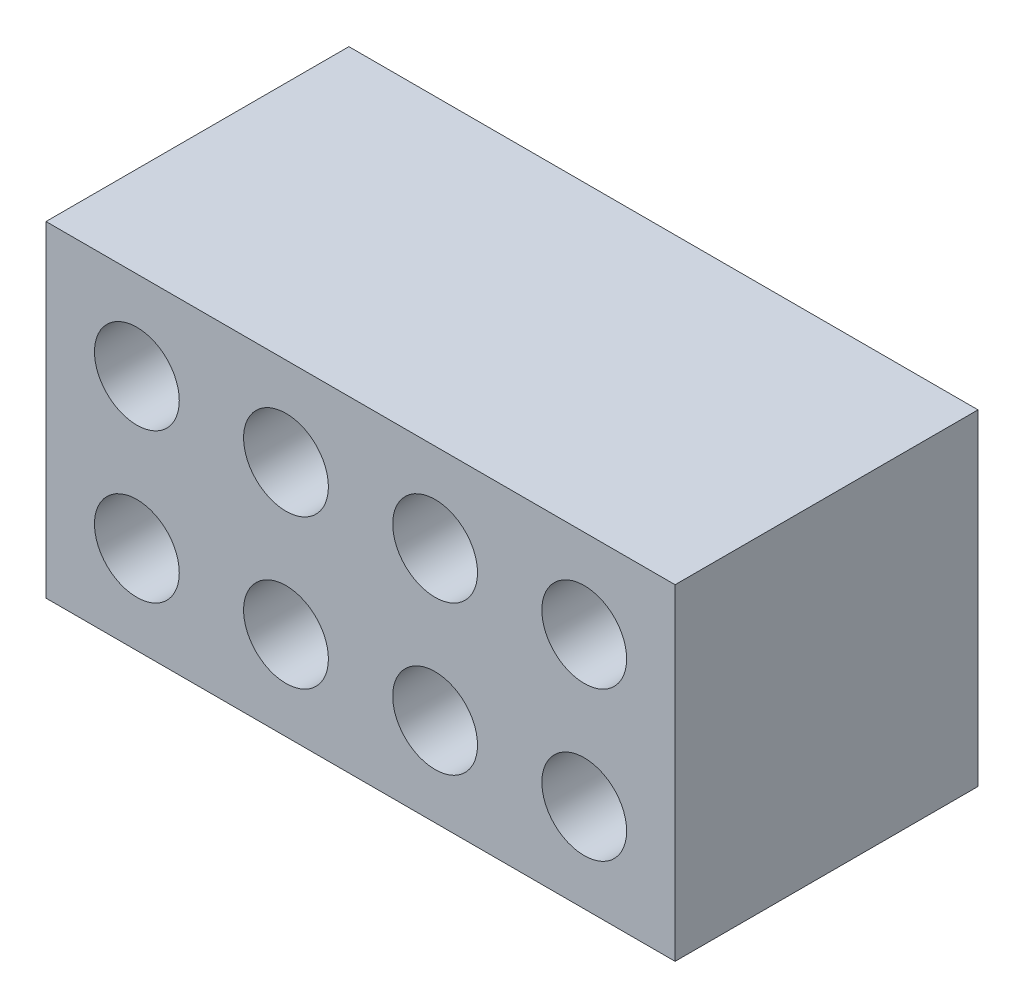
ISO-10303-21;
HEADER;
FILE_DESCRIPTION(('STEP AP214'),'2;1');
FILE_NAME('part.step','',(''),(''),'','','');
FILE_SCHEMA(('AUTOMOTIVE_DESIGN { 1 0 10303 214 1 1 1 1 }'));
ENDSEC;
DATA;
#1=APPLICATION_CONTEXT('core data for automotive mechanical design processes');
#2=APPLICATION_PROTOCOL_DEFINITION('international standard','automotive_design',2000,#1);
#3=PRODUCT_CONTEXT('',#1,'mechanical');
#4=PRODUCT('Part','Part','',(#3));
#5=PRODUCT_RELATED_PRODUCT_CATEGORY('part','',(#4));
#6=PRODUCT_DEFINITION_FORMATION('','',#4);
#7=PRODUCT_DEFINITION_CONTEXT('part definition',#1,'design');
#8=PRODUCT_DEFINITION('design','',#6,#7);
#9=PRODUCT_DEFINITION_SHAPE('','',#8);
#10=(LENGTH_UNIT() NAMED_UNIT(*) SI_UNIT(.MILLI.,.METRE.));
#11=(NAMED_UNIT(*) PLANE_ANGLE_UNIT() SI_UNIT($,.RADIAN.));
#12=(NAMED_UNIT(*) SI_UNIT($,.STERADIAN.) SOLID_ANGLE_UNIT());
#13=UNCERTAINTY_MEASURE_WITH_UNIT(LENGTH_MEASURE(1.E-05),#10,'distance_accuracy_value','');
#14=(GEOMETRIC_REPRESENTATION_CONTEXT(3) GLOBAL_UNCERTAINTY_ASSIGNED_CONTEXT((#13)) GLOBAL_UNIT_ASSIGNED_CONTEXT((#10,
#11,#12)) REPRESENTATION_CONTEXT('',''));
#15=CARTESIAN_POINT('',(0.,0.,0.));
#16=DIRECTION('',(0.,0.,1.));
#17=DIRECTION('',(1.,0.,0.));
#18=AXIS2_PLACEMENT_3D('',#15,#16,#17);
#19=CARTESIAN_POINT('',(67.5,-35.,65.));
#20=DIRECTION('',(-1.,0.,0.));
#21=DIRECTION('',(0.,0.,1.));
#22=AXIS2_PLACEMENT_3D('',#19,#20,#21);
#23=PLANE('',#22);
#24=DIRECTION('',(0.,1.,0.));
#25=VECTOR('',#24,1.);
#26=CARTESIAN_POINT('',(67.5,-35.,0.));
#27=LINE('',#26,#25);
#28=CARTESIAN_POINT('',(67.5,-35.,0.));
#29=VERTEX_POINT('',#28);
#30=CARTESIAN_POINT('',(67.5,35.,0.));
#31=VERTEX_POINT('',#30);
#32=EDGE_CURVE('E104',#29,#31,#27,.T.);
#33=ORIENTED_EDGE('',*,*,#32,.T.);
#34=DIRECTION('',(0.,0.,-1.));
#35=VECTOR('',#34,1.);
#36=CARTESIAN_POINT('',(67.5,35.,65.));
#37=LINE('',#36,#35);
#38=CARTESIAN_POINT('',(67.5,35.,65.));
#39=VERTEX_POINT('',#38);
#40=EDGE_CURVE('E11',#39,#31,#37,.T.);
#41=ORIENTED_EDGE('',*,*,#40,.F.);
#42=DIRECTION('',(0.,1.,0.));
#43=VECTOR('',#42,1.);
#44=CARTESIAN_POINT('',(67.5,-35.,65.));
#45=LINE('',#44,#43);
#46=CARTESIAN_POINT('',(67.5,-35.,65.));
#47=VERTEX_POINT('',#46);
#48=EDGE_CURVE('E95',#47,#39,#45,.T.);
#49=ORIENTED_EDGE('',*,*,#48,.F.);
#50=DIRECTION('',(0.,0.,-1.));
#51=VECTOR('',#50,1.);
#52=CARTESIAN_POINT('',(67.5,-35.,65.));
#53=LINE('',#52,#51);
#54=EDGE_CURVE('E101',#47,#29,#53,.T.);
#55=ORIENTED_EDGE('',*,*,#54,.T.);
#56=EDGE_LOOP('',(#33,#41,#49,#55));
#57=FACE_BOUND('',#56,.T.);
#58=ADVANCED_FACE('F39',(#57),#23,.F.);
#59=CARTESIAN_POINT('',(-67.5,35.,65.));
#60=DIRECTION('',(0.,-1.,0.));
#61=DIRECTION('',(0.,0.,-1.));
#62=AXIS2_PLACEMENT_3D('',#59,#60,#61);
#63=PLANE('',#62);
#64=DIRECTION('',(-1.,0.,0.));
#65=VECTOR('',#64,1.);
#66=CARTESIAN_POINT('',(-67.5,35.,0.));
#67=LINE('',#66,#65);
#68=CARTESIAN_POINT('',(-67.5,35.,0.));
#69=VERTEX_POINT('',#68);
#70=EDGE_CURVE('E96',#31,#69,#67,.T.);
#71=ORIENTED_EDGE('',*,*,#70,.T.);
#72=DIRECTION('',(0.,0.,-1.));
#73=VECTOR('',#72,1.);
#74=CARTESIAN_POINT('',(-67.5,35.,65.));
#75=LINE('',#74,#73);
#76=CARTESIAN_POINT('',(-67.5,35.,65.));
#77=VERTEX_POINT('',#76);
#78=EDGE_CURVE('E48',#77,#69,#75,.T.);
#79=ORIENTED_EDGE('',*,*,#78,.F.);
#80=DIRECTION('',(-1.,0.,0.));
#81=VECTOR('',#80,1.);
#82=CARTESIAN_POINT('',(-67.5,35.,65.));
#83=LINE('',#82,#81);
#84=EDGE_CURVE('E87',#39,#77,#83,.T.);
#85=ORIENTED_EDGE('',*,*,#84,.F.);
#86=ORIENTED_EDGE('',*,*,#40,.T.);
#87=EDGE_LOOP('',(#71,#79,#85,#86));
#88=FACE_BOUND('',#87,.T.);
#89=ADVANCED_FACE('F92',(#88),#63,.F.);
#90=CARTESIAN_POINT('',(-67.5,-35.,65.));
#91=DIRECTION('',(1.,0.,0.));
#92=DIRECTION('',(0.,0.,-1.));
#93=AXIS2_PLACEMENT_3D('',#90,#91,#92);
#94=PLANE('',#93);
#95=DIRECTION('',(0.,-1.,0.));
#96=VECTOR('',#95,1.);
#97=CARTESIAN_POINT('',(-67.5,-35.,0.));
#98=LINE('',#97,#96);
#99=CARTESIAN_POINT('',(-67.5,-35.,0.));
#100=VERTEX_POINT('',#99);
#101=EDGE_CURVE('E74',#69,#100,#98,.T.);
#102=ORIENTED_EDGE('',*,*,#101,.T.);
#103=DIRECTION('',(0.,0.,-1.));
#104=VECTOR('',#103,1.);
#105=CARTESIAN_POINT('',(-67.5,-35.,65.));
#106=LINE('',#105,#104);
#107=CARTESIAN_POINT('',(-67.5,-35.,65.));
#108=VERTEX_POINT('',#107);
#109=EDGE_CURVE('E100',#108,#100,#106,.T.);
#110=ORIENTED_EDGE('',*,*,#109,.F.);
#111=DIRECTION('',(0.,-1.,0.));
#112=VECTOR('',#111,1.);
#113=CARTESIAN_POINT('',(-67.5,-35.,65.));
#114=LINE('',#113,#112);
#115=EDGE_CURVE('E89',#77,#108,#114,.T.);
#116=ORIENTED_EDGE('',*,*,#115,.F.);
#117=ORIENTED_EDGE('',*,*,#78,.T.);
#118=EDGE_LOOP('',(#102,#110,#116,#117));
#119=FACE_BOUND('',#118,.T.);
#120=ADVANCED_FACE('F97',(#119),#94,.F.);
#121=CARTESIAN_POINT('',(-67.5,-35.,65.));
#122=DIRECTION('',(0.,1.,0.));
#123=DIRECTION('',(0.,0.,1.));
#124=AXIS2_PLACEMENT_3D('',#121,#122,#123);
#125=PLANE('',#124);
#126=DIRECTION('',(1.,0.,0.));
#127=VECTOR('',#126,1.);
#128=CARTESIAN_POINT('',(-67.5,-35.,0.));
#129=LINE('',#128,#127);
#130=EDGE_CURVE('E76',#100,#29,#129,.T.);
#131=ORIENTED_EDGE('',*,*,#130,.T.);
#132=ORIENTED_EDGE('',*,*,#54,.F.);
#133=DIRECTION('',(1.,0.,0.));
#134=VECTOR('',#133,1.);
#135=CARTESIAN_POINT('',(-67.5,-35.,65.));
#136=LINE('',#135,#134);
#137=EDGE_CURVE('E60',#108,#47,#136,.T.);
#138=ORIENTED_EDGE('',*,*,#137,.F.);
#139=ORIENTED_EDGE('',*,*,#109,.T.);
#140=EDGE_LOOP('',(#131,#132,#138,#139));
#141=FACE_BOUND('',#140,.T.);
#142=ADVANCED_FACE('F161',(#141),#125,.F.);
#143=CARTESIAN_POINT('',(0.,0.,65.));
#144=DIRECTION('',(0.,0.,-1.));
#145=DIRECTION('',(-1.,0.,0.));
#146=AXIS2_PLACEMENT_3D('',#143,#144,#145);
#147=PLANE('',#146);
#148=CARTESIAN_POINT('',(-48.,16.,65.));
#149=DIRECTION('',(0.,0.,1.));
#150=DIRECTION('',(1.,0.,0.));
#151=AXIS2_PLACEMENT_3D('',#148,#149,#150);
#152=CIRCLE('',#151,9.1);
#153=CARTESIAN_POINT('',(-38.9,16.,65.));
#154=VERTEX_POINT('',#153);
#155=EDGE_CURVE('E285',#154,#154,#152,.T.);
#156=ORIENTED_EDGE('',*,*,#155,.F.);
#157=EDGE_LOOP('',(#156));
#158=FACE_BOUND('',#157,.T.);
#159=CARTESIAN_POINT('',(48.,-16.,65.));
#160=DIRECTION('',(0.,0.,1.));
#161=DIRECTION('',(1.,0.,0.));
#162=AXIS2_PLACEMENT_3D('',#159,#160,#161);
#163=CIRCLE('',#162,9.1);
#164=CARTESIAN_POINT('',(57.1,-16.,65.));
#165=VERTEX_POINT('',#164);
#166=EDGE_CURVE('E283',#165,#165,#163,.T.);
#167=ORIENTED_EDGE('',*,*,#166,.F.);
#168=EDGE_LOOP('',(#167));
#169=FACE_BOUND('',#168,.T.);
#170=CARTESIAN_POINT('',(16.,-16.,65.));
#171=DIRECTION('',(0.,0.,1.));
#172=DIRECTION('',(1.,0.,0.));
#173=AXIS2_PLACEMENT_3D('',#170,#171,#172);
#174=CIRCLE('',#173,9.1);
#175=CARTESIAN_POINT('',(25.1,-16.,65.));
#176=VERTEX_POINT('',#175);
#177=EDGE_CURVE('E282',#176,#176,#174,.T.);
#178=ORIENTED_EDGE('',*,*,#177,.F.);
#179=EDGE_LOOP('',(#178));
#180=FACE_BOUND('',#179,.T.);
#181=CARTESIAN_POINT('',(-16.,-16.,65.));
#182=DIRECTION('',(0.,0.,1.));
#183=DIRECTION('',(1.,0.,0.));
#184=AXIS2_PLACEMENT_3D('',#181,#182,#183);
#185=CIRCLE('',#184,9.1);
#186=CARTESIAN_POINT('',(-6.9,-16.,65.));
#187=VERTEX_POINT('',#186);
#188=EDGE_CURVE('E290',#187,#187,#185,.T.);
#189=ORIENTED_EDGE('',*,*,#188,.F.);
#190=EDGE_LOOP('',(#189));
#191=FACE_BOUND('',#190,.T.);
#192=CARTESIAN_POINT('',(-16.,16.,65.));
#193=DIRECTION('',(0.,0.,1.));
#194=DIRECTION('',(1.,0.,0.));
#195=AXIS2_PLACEMENT_3D('',#192,#193,#194);
#196=CIRCLE('',#195,9.1);
#197=CARTESIAN_POINT('',(-6.9,16.,65.));
#198=VERTEX_POINT('',#197);
#199=EDGE_CURVE('E288',#198,#198,#196,.T.);
#200=ORIENTED_EDGE('',*,*,#199,.F.);
#201=EDGE_LOOP('',(#200));
#202=FACE_BOUND('',#201,.T.);
#203=CARTESIAN_POINT('',(16.,16.,65.));
#204=DIRECTION('',(0.,0.,1.));
#205=DIRECTION('',(1.,0.,0.));
#206=AXIS2_PLACEMENT_3D('',#203,#204,#205);
#207=CIRCLE('',#206,9.1);
#208=CARTESIAN_POINT('',(25.1,16.,65.));
#209=VERTEX_POINT('',#208);
#210=EDGE_CURVE('E315',#209,#209,#207,.T.);
#211=ORIENTED_EDGE('',*,*,#210,.F.);
#212=EDGE_LOOP('',(#211));
#213=FACE_BOUND('',#212,.T.);
#214=CARTESIAN_POINT('',(48.,16.,65.));
#215=DIRECTION('',(0.,0.,1.));
#216=DIRECTION('',(1.,0.,0.));
#217=AXIS2_PLACEMENT_3D('',#214,#215,#216);
#218=CIRCLE('',#217,9.1);
#219=CARTESIAN_POINT('',(57.1,16.,65.));
#220=VERTEX_POINT('',#219);
#221=EDGE_CURVE('E291',#220,#220,#218,.T.);
#222=ORIENTED_EDGE('',*,*,#221,.F.);
#223=EDGE_LOOP('',(#222));
#224=FACE_BOUND('',#223,.T.);
#225=CARTESIAN_POINT('',(-48.,-16.,65.));
#226=DIRECTION('',(0.,0.,1.));
#227=DIRECTION('',(1.,0.,0.));
#228=AXIS2_PLACEMENT_3D('',#225,#226,#227);
#229=CIRCLE('',#228,9.1);
#230=CARTESIAN_POINT('',(-38.9,-16.,65.));
#231=VERTEX_POINT('',#230);
#232=EDGE_CURVE('E119',#231,#231,#229,.T.);
#233=ORIENTED_EDGE('',*,*,#232,.F.);
#234=EDGE_LOOP('',(#233));
#235=FACE_BOUND('',#234,.T.);
#236=ORIENTED_EDGE('',*,*,#48,.T.);
#237=ORIENTED_EDGE('',*,*,#84,.T.);
#238=ORIENTED_EDGE('',*,*,#115,.T.);
#239=ORIENTED_EDGE('',*,*,#137,.T.);
#240=EDGE_LOOP('',(#236,#237,#238,#239));
#241=FACE_BOUND('',#240,.T.);
#242=ADVANCED_FACE('F86',(#158,#169,#180,#191,#202,#213,#224,#235,#241),#147,.F.);
#243=CARTESIAN_POINT('',(0.,0.,0.));
#244=DIRECTION('',(0.,0.,-1.));
#245=DIRECTION('',(-1.,0.,0.));
#246=AXIS2_PLACEMENT_3D('',#243,#244,#245);
#247=PLANE('',#246);
#248=CARTESIAN_POINT('',(-48.,16.,0.));
#249=DIRECTION('',(0.,0.,-1.));
#250=DIRECTION('',(-1.,0.,0.));
#251=AXIS2_PLACEMENT_3D('',#248,#249,#250);
#252=CIRCLE('',#251,9.1);
#253=CARTESIAN_POINT('',(-57.1,16.,0.));
#254=VERTEX_POINT('',#253);
#255=EDGE_CURVE('E45',#254,#254,#252,.T.);
#256=ORIENTED_EDGE('',*,*,#255,.F.);
#257=EDGE_LOOP('',(#256));
#258=FACE_BOUND('',#257,.T.);
#259=CARTESIAN_POINT('',(48.,-16.,0.));
#260=DIRECTION('',(0.,0.,-1.));
#261=DIRECTION('',(-1.,0.,0.));
#262=AXIS2_PLACEMENT_3D('',#259,#260,#261);
#263=CIRCLE('',#262,9.1);
#264=CARTESIAN_POINT('',(38.9,-16.,0.));
#265=VERTEX_POINT('',#264);
#266=EDGE_CURVE('E133',#265,#265,#263,.T.);
#267=ORIENTED_EDGE('',*,*,#266,.F.);
#268=EDGE_LOOP('',(#267));
#269=FACE_BOUND('',#268,.T.);
#270=CARTESIAN_POINT('',(16.,-16.,0.));
#271=DIRECTION('',(0.,0.,-1.));
#272=DIRECTION('',(-1.,0.,0.));
#273=AXIS2_PLACEMENT_3D('',#270,#271,#272);
#274=CIRCLE('',#273,9.1);
#275=CARTESIAN_POINT('',(6.9,-16.,0.));
#276=VERTEX_POINT('',#275);
#277=EDGE_CURVE('E129',#276,#276,#274,.T.);
#278=ORIENTED_EDGE('',*,*,#277,.F.);
#279=EDGE_LOOP('',(#278));
#280=FACE_BOUND('',#279,.T.);
#281=CARTESIAN_POINT('',(-16.,-16.,0.));
#282=DIRECTION('',(0.,0.,-1.));
#283=DIRECTION('',(-1.,0.,0.));
#284=AXIS2_PLACEMENT_3D('',#281,#282,#283);
#285=CIRCLE('',#284,9.1);
#286=CARTESIAN_POINT('',(-25.1,-16.,0.));
#287=VERTEX_POINT('',#286);
#288=EDGE_CURVE('E127',#287,#287,#285,.T.);
#289=ORIENTED_EDGE('',*,*,#288,.F.);
#290=EDGE_LOOP('',(#289));
#291=FACE_BOUND('',#290,.T.);
#292=CARTESIAN_POINT('',(-16.,16.,0.));
#293=DIRECTION('',(0.,0.,-1.));
#294=DIRECTION('',(-1.,0.,0.));
#295=AXIS2_PLACEMENT_3D('',#292,#293,#294);
#296=CIRCLE('',#295,9.1);
#297=CARTESIAN_POINT('',(-25.1,16.,0.));
#298=VERTEX_POINT('',#297);
#299=EDGE_CURVE('E124',#298,#298,#296,.T.);
#300=ORIENTED_EDGE('',*,*,#299,.F.);
#301=EDGE_LOOP('',(#300));
#302=FACE_BOUND('',#301,.T.);
#303=CARTESIAN_POINT('',(16.,16.,0.));
#304=DIRECTION('',(0.,0.,-1.));
#305=DIRECTION('',(-1.,0.,0.));
#306=AXIS2_PLACEMENT_3D('',#303,#304,#305);
#307=CIRCLE('',#306,9.1);
#308=CARTESIAN_POINT('',(6.9,16.,0.));
#309=VERTEX_POINT('',#308);
#310=EDGE_CURVE('E116',#309,#309,#307,.T.);
#311=ORIENTED_EDGE('',*,*,#310,.F.);
#312=EDGE_LOOP('',(#311));
#313=FACE_BOUND('',#312,.T.);
#314=CARTESIAN_POINT('',(48.,16.,0.));
#315=DIRECTION('',(0.,0.,-1.));
#316=DIRECTION('',(-1.,0.,0.));
#317=AXIS2_PLACEMENT_3D('',#314,#315,#316);
#318=CIRCLE('',#317,9.1);
#319=CARTESIAN_POINT('',(38.9,16.,0.));
#320=VERTEX_POINT('',#319);
#321=EDGE_CURVE('E118',#320,#320,#318,.T.);
#322=ORIENTED_EDGE('',*,*,#321,.F.);
#323=EDGE_LOOP('',(#322));
#324=FACE_BOUND('',#323,.T.);
#325=CARTESIAN_POINT('',(-48.,-16.,0.));
#326=DIRECTION('',(0.,0.,-1.));
#327=DIRECTION('',(-1.,0.,0.));
#328=AXIS2_PLACEMENT_3D('',#325,#326,#327);
#329=CIRCLE('',#328,9.1);
#330=CARTESIAN_POINT('',(-57.1,-16.,0.));
#331=VERTEX_POINT('',#330);
#332=EDGE_CURVE('E114',#331,#331,#329,.T.);
#333=ORIENTED_EDGE('',*,*,#332,.F.);
#334=EDGE_LOOP('',(#333));
#335=FACE_BOUND('',#334,.T.);
#336=ORIENTED_EDGE('',*,*,#32,.F.);
#337=ORIENTED_EDGE('',*,*,#130,.F.);
#338=ORIENTED_EDGE('',*,*,#101,.F.);
#339=ORIENTED_EDGE('',*,*,#70,.F.);
#340=EDGE_LOOP('',(#336,#337,#338,#339));
#341=FACE_BOUND('',#340,.T.);
#342=ADVANCED_FACE('F143',(#258,#269,#280,#291,#302,#313,#324,#335,#341),#247,.T.);
#343=CARTESIAN_POINT('',(-48.,-16.,-1.));
#344=DIRECTION('',(0.,0.,1.));
#345=DIRECTION('',(1.,0.,0.));
#346=AXIS2_PLACEMENT_3D('',#343,#344,#345);
#347=CYLINDRICAL_SURFACE('',#346,9.1);
#348=ORIENTED_EDGE('',*,*,#332,.T.);
#349=EDGE_LOOP('',(#348));
#350=FACE_BOUND('',#349,.T.);
#351=ORIENTED_EDGE('',*,*,#232,.T.);
#352=EDGE_LOOP('',(#351));
#353=FACE_BOUND('',#352,.T.);
#354=ADVANCED_FACE('F145',(#350,#353),#347,.F.);
#355=CARTESIAN_POINT('',(48.,16.,-1.));
#356=DIRECTION('',(0.,0.,1.));
#357=DIRECTION('',(1.,0.,0.));
#358=AXIS2_PLACEMENT_3D('',#355,#356,#357);
#359=CYLINDRICAL_SURFACE('',#358,9.1);
#360=ORIENTED_EDGE('',*,*,#321,.T.);
#361=EDGE_LOOP('',(#360));
#362=FACE_BOUND('',#361,.T.);
#363=ORIENTED_EDGE('',*,*,#221,.T.);
#364=EDGE_LOOP('',(#363));
#365=FACE_BOUND('',#364,.T.);
#366=ADVANCED_FACE('F208',(#362,#365),#359,.F.);
#367=CARTESIAN_POINT('',(16.,16.,-1.));
#368=DIRECTION('',(0.,0.,1.));
#369=DIRECTION('',(1.,0.,0.));
#370=AXIS2_PLACEMENT_3D('',#367,#368,#369);
#371=CYLINDRICAL_SURFACE('',#370,9.1);
#372=ORIENTED_EDGE('',*,*,#310,.T.);
#373=EDGE_LOOP('',(#372));
#374=FACE_BOUND('',#373,.T.);
#375=ORIENTED_EDGE('',*,*,#210,.T.);
#376=EDGE_LOOP('',(#375));
#377=FACE_BOUND('',#376,.T.);
#378=ADVANCED_FACE('F217',(#374,#377),#371,.F.);
#379=CARTESIAN_POINT('',(-16.,16.,-1.));
#380=DIRECTION('',(0.,0.,1.));
#381=DIRECTION('',(1.,0.,0.));
#382=AXIS2_PLACEMENT_3D('',#379,#380,#381);
#383=CYLINDRICAL_SURFACE('',#382,9.1);
#384=ORIENTED_EDGE('',*,*,#299,.T.);
#385=EDGE_LOOP('',(#384));
#386=FACE_BOUND('',#385,.T.);
#387=ORIENTED_EDGE('',*,*,#199,.T.);
#388=EDGE_LOOP('',(#387));
#389=FACE_BOUND('',#388,.T.);
#390=ADVANCED_FACE('F227',(#386,#389),#383,.F.);
#391=CARTESIAN_POINT('',(-16.,-16.,-1.));
#392=DIRECTION('',(0.,0.,1.));
#393=DIRECTION('',(1.,0.,0.));
#394=AXIS2_PLACEMENT_3D('',#391,#392,#393);
#395=CYLINDRICAL_SURFACE('',#394,9.1);
#396=ORIENTED_EDGE('',*,*,#288,.T.);
#397=EDGE_LOOP('',(#396));
#398=FACE_BOUND('',#397,.T.);
#399=ORIENTED_EDGE('',*,*,#188,.T.);
#400=EDGE_LOOP('',(#399));
#401=FACE_BOUND('',#400,.T.);
#402=ADVANCED_FACE('F236',(#398,#401),#395,.F.);
#403=CARTESIAN_POINT('',(16.,-16.,-1.));
#404=DIRECTION('',(0.,0.,1.));
#405=DIRECTION('',(1.,0.,0.));
#406=AXIS2_PLACEMENT_3D('',#403,#404,#405);
#407=CYLINDRICAL_SURFACE('',#406,9.1);
#408=ORIENTED_EDGE('',*,*,#277,.T.);
#409=EDGE_LOOP('',(#408));
#410=FACE_BOUND('',#409,.T.);
#411=ORIENTED_EDGE('',*,*,#177,.T.);
#412=EDGE_LOOP('',(#411));
#413=FACE_BOUND('',#412,.T.);
#414=ADVANCED_FACE('F249',(#410,#413),#407,.F.);
#415=CARTESIAN_POINT('',(48.,-16.,-1.));
#416=DIRECTION('',(0.,0.,1.));
#417=DIRECTION('',(1.,0.,0.));
#418=AXIS2_PLACEMENT_3D('',#415,#416,#417);
#419=CYLINDRICAL_SURFACE('',#418,9.1);
#420=ORIENTED_EDGE('',*,*,#266,.T.);
#421=EDGE_LOOP('',(#420));
#422=FACE_BOUND('',#421,.T.);
#423=ORIENTED_EDGE('',*,*,#166,.T.);
#424=EDGE_LOOP('',(#423));
#425=FACE_BOUND('',#424,.T.);
#426=ADVANCED_FACE('F256',(#422,#425),#419,.F.);
#427=CARTESIAN_POINT('',(-48.,16.,-1.));
#428=DIRECTION('',(0.,0.,1.));
#429=DIRECTION('',(1.,0.,0.));
#430=AXIS2_PLACEMENT_3D('',#427,#428,#429);
#431=CYLINDRICAL_SURFACE('',#430,9.1);
#432=ORIENTED_EDGE('',*,*,#255,.T.);
#433=EDGE_LOOP('',(#432));
#434=FACE_BOUND('',#433,.T.);
#435=ORIENTED_EDGE('',*,*,#155,.T.);
#436=EDGE_LOOP('',(#435));
#437=FACE_BOUND('',#436,.T.);
#438=ADVANCED_FACE('F139',(#434,#437),#431,.F.);
#439=CLOSED_SHELL('',(#58,#89,#120,#142,#242,#342,#354,#366,#378,#390,#402,#414,#426,#438));
#440=MANIFOLD_SOLID_BREP('B2',#439);
#441=ADVANCED_BREP_SHAPE_REPRESENTATION('',(#18,#440),#14);
#442=SHAPE_DEFINITION_REPRESENTATION(#9,#441);
ENDSEC;
END-ISO-10303-21;
